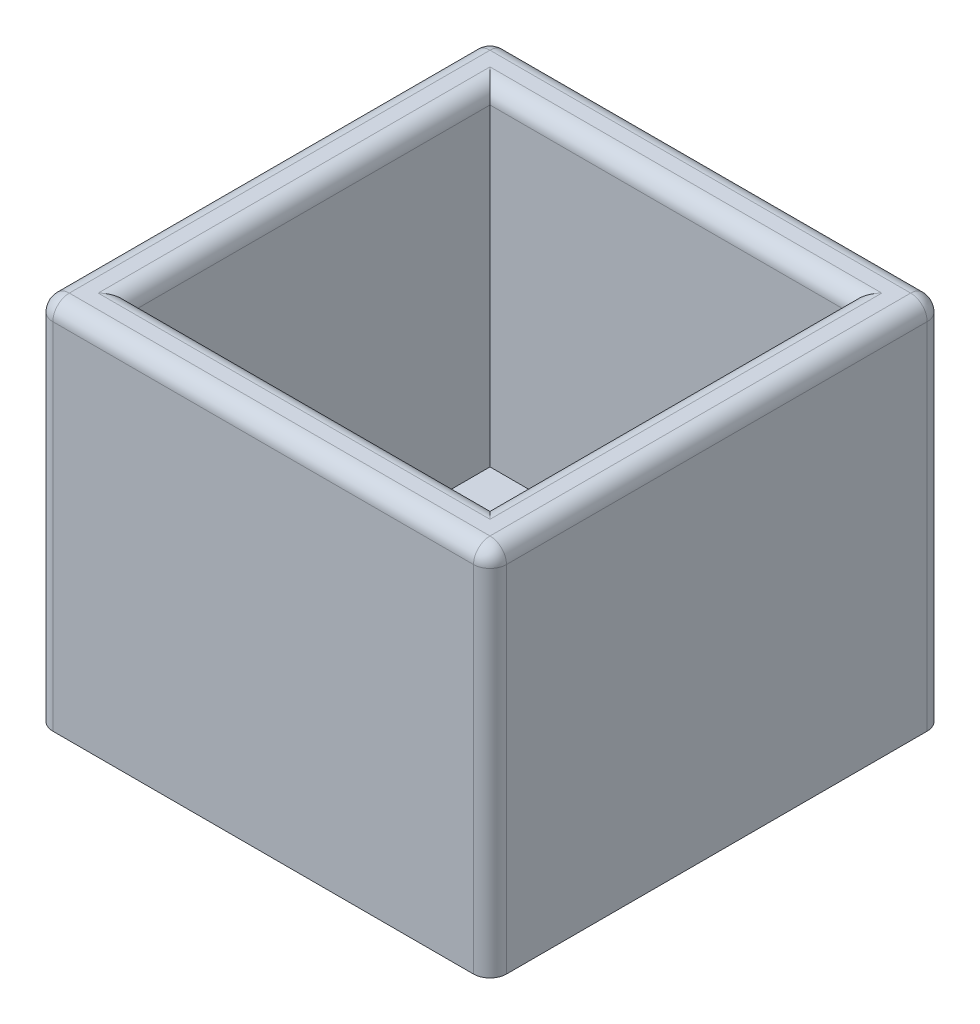
ISO-10303-21;
HEADER;
FILE_DESCRIPTION(('STEP AP214'),'2;1');
FILE_NAME('part.step','',(''),(''),'','','');
FILE_SCHEMA(('AUTOMOTIVE_DESIGN { 1 0 10303 214 1 1 1 1 }'));
ENDSEC;
DATA;
#1=APPLICATION_CONTEXT('core data for automotive mechanical design processes');
#2=APPLICATION_PROTOCOL_DEFINITION('international standard','automotive_design',2000,#1);
#3=PRODUCT_CONTEXT('',#1,'mechanical');
#4=PRODUCT('Part','Part','',(#3));
#5=PRODUCT_RELATED_PRODUCT_CATEGORY('part','',(#4));
#6=PRODUCT_DEFINITION_FORMATION('','',#4);
#7=PRODUCT_DEFINITION_CONTEXT('part definition',#1,'design');
#8=PRODUCT_DEFINITION('design','',#6,#7);
#9=PRODUCT_DEFINITION_SHAPE('','',#8);
#10=(LENGTH_UNIT() NAMED_UNIT(*) SI_UNIT(.MILLI.,.METRE.));
#11=(NAMED_UNIT(*) PLANE_ANGLE_UNIT() SI_UNIT($,.RADIAN.));
#12=(NAMED_UNIT(*) SI_UNIT($,.STERADIAN.) SOLID_ANGLE_UNIT());
#13=UNCERTAINTY_MEASURE_WITH_UNIT(LENGTH_MEASURE(1.E-05),#10,'distance_accuracy_value','');
#14=(GEOMETRIC_REPRESENTATION_CONTEXT(3) GLOBAL_UNCERTAINTY_ASSIGNED_CONTEXT((#13)) GLOBAL_UNIT_ASSIGNED_CONTEXT((#10,
#11,#12)) REPRESENTATION_CONTEXT('',''));
#15=CARTESIAN_POINT('',(0.,0.,0.));
#16=DIRECTION('',(0.,0.,1.));
#17=DIRECTION('',(1.,0.,0.));
#18=AXIS2_PLACEMENT_3D('',#15,#16,#17);
#19=CARTESIAN_POINT('',(-27.5,22.5,55.));
#20=DIRECTION('',(0.,-1.,0.));
#21=DIRECTION('',(0.,0.,-1.));
#22=AXIS2_PLACEMENT_3D('',#19,#20,#21);
#23=PLANE('',#22);
#24=DIRECTION('',(1.,0.,0.));
#25=VECTOR('',#24,1.);
#26=CARTESIAN_POINT('',(-27.5,22.5,51.25));
#27=LINE('',#26,#25);
#28=CARTESIAN_POINT('',(23.75,22.5,51.25));
#29=VERTEX_POINT('',#28);
#30=CARTESIAN_POINT('',(-23.75,22.5,51.25));
#31=VERTEX_POINT('',#30);
#32=EDGE_CURVE('E211',#29,#31,#27,.F.);
#33=ORIENTED_EDGE('',*,*,#32,.T.);
#34=DIRECTION('',(0.,0.,1.));
#35=VECTOR('',#34,1.);
#36=CARTESIAN_POINT('',(-23.75,22.5,55.));
#37=LINE('',#36,#35);
#38=CARTESIAN_POINT('',(-23.75,22.5,3.75000000000001));
#39=VERTEX_POINT('',#38);
#40=EDGE_CURVE('E213',#31,#39,#37,.F.);
#41=ORIENTED_EDGE('',*,*,#40,.T.);
#42=DIRECTION('',(1.,0.,0.));
#43=VECTOR('',#42,1.);
#44=CARTESIAN_POINT('',(21.75,22.5,3.75000000000001));
#45=LINE('',#44,#43);
#46=CARTESIAN_POINT('',(23.75,22.5,3.75000000000001));
#47=VERTEX_POINT('',#46);
#48=EDGE_CURVE('E209',#39,#47,#45,.T.);
#49=ORIENTED_EDGE('',*,*,#48,.T.);
#50=DIRECTION('',(0.,0.,1.));
#51=VECTOR('',#50,1.);
#52=CARTESIAN_POINT('',(23.75,22.5,49.25));
#53=LINE('',#52,#51);
#54=EDGE_CURVE('E207',#47,#29,#53,.T.);
#55=ORIENTED_EDGE('',*,*,#54,.T.);
#56=EDGE_LOOP('',(#33,#41,#49,#55));
#57=FACE_BOUND('',#56,.T.);
#58=DIRECTION('',(-1.,0.,0.));
#59=VECTOR('',#58,1.);
#60=CARTESIAN_POINT('',(-27.5,22.5,2.));
#61=LINE('',#60,#59);
#62=CARTESIAN_POINT('',(25.5,22.5,2.));
#63=VERTEX_POINT('',#62);
#64=CARTESIAN_POINT('',(-25.5,22.5,2.));
#65=VERTEX_POINT('',#64);
#66=EDGE_CURVE('E202',#63,#65,#61,.T.);
#67=ORIENTED_EDGE('',*,*,#66,.T.);
#68=DIRECTION('',(0.,0.,-1.));
#69=VECTOR('',#68,1.);
#70=CARTESIAN_POINT('',(-25.5,22.5,55.));
#71=LINE('',#70,#69);
#72=CARTESIAN_POINT('',(-25.5,22.5,53.));
#73=VERTEX_POINT('',#72);
#74=EDGE_CURVE('E204',#65,#73,#71,.F.);
#75=ORIENTED_EDGE('',*,*,#74,.T.);
#76=DIRECTION('',(-1.,0.,0.));
#77=VECTOR('',#76,1.);
#78=CARTESIAN_POINT('',(27.5,22.5,53.));
#79=LINE('',#78,#77);
#80=CARTESIAN_POINT('',(25.5,22.5,53.));
#81=VERTEX_POINT('',#80);
#82=EDGE_CURVE('E198',#73,#81,#79,.F.);
#83=ORIENTED_EDGE('',*,*,#82,.T.);
#84=DIRECTION('',(0.,0.,-1.));
#85=VECTOR('',#84,1.);
#86=CARTESIAN_POINT('',(25.5,22.5,55.));
#87=LINE('',#86,#85);
#88=EDGE_CURVE('E200',#81,#63,#87,.T.);
#89=ORIENTED_EDGE('',*,*,#88,.T.);
#90=EDGE_LOOP('',(#67,#75,#83,#89));
#91=FACE_BOUND('',#90,.T.);
#92=ADVANCED_FACE('F33',(#57,#91),#23,.F.);
#93=CARTESIAN_POINT('',(27.5,22.5,55.));
#94=DIRECTION('',(-1.,0.,0.));
#95=DIRECTION('',(0.,0.,1.));
#96=AXIS2_PLACEMENT_3D('',#93,#94,#95);
#97=PLANE('',#96);
#98=DIRECTION('',(0.,0.,-1.));
#99=VECTOR('',#98,1.);
#100=CARTESIAN_POINT('',(27.5,-22.5,55.));
#101=LINE('',#100,#99);
#102=CARTESIAN_POINT('',(27.5,-22.5,53.));
#103=VERTEX_POINT('',#102);
#104=CARTESIAN_POINT('',(27.5,-22.5,2.));
#105=VERTEX_POINT('',#104);
#106=EDGE_CURVE('E187',#103,#105,#101,.T.);
#107=ORIENTED_EDGE('',*,*,#106,.T.);
#108=DIRECTION('',(0.,1.,0.));
#109=VECTOR('',#108,1.);
#110=CARTESIAN_POINT('',(27.5,22.5,2.));
#111=LINE('',#110,#109);
#112=CARTESIAN_POINT('',(27.5,20.5,2.));
#113=VERTEX_POINT('',#112);
#114=EDGE_CURVE('E246',#105,#113,#111,.T.);
#115=ORIENTED_EDGE('',*,*,#114,.T.);
#116=DIRECTION('',(0.,0.,-1.));
#117=VECTOR('',#116,1.);
#118=CARTESIAN_POINT('',(27.5,20.5,55.));
#119=LINE('',#118,#117);
#120=CARTESIAN_POINT('',(27.5,20.5,53.));
#121=VERTEX_POINT('',#120);
#122=EDGE_CURVE('E244',#113,#121,#119,.F.);
#123=ORIENTED_EDGE('',*,*,#122,.T.);
#124=DIRECTION('',(0.,1.,0.));
#125=VECTOR('',#124,1.);
#126=CARTESIAN_POINT('',(27.5,-22.5,53.));
#127=LINE('',#126,#125);
#128=EDGE_CURVE('E242',#121,#103,#127,.F.);
#129=ORIENTED_EDGE('',*,*,#128,.T.);
#130=EDGE_LOOP('',(#107,#115,#123,#129));
#131=FACE_BOUND('',#130,.T.);
#132=ADVANCED_FACE('F300',(#131),#97,.F.);
#133=CARTESIAN_POINT('',(-27.5,22.5,55.));
#134=DIRECTION('',(1.,0.,0.));
#135=DIRECTION('',(0.,0.,-1.));
#136=AXIS2_PLACEMENT_3D('',#133,#134,#135);
#137=PLANE('',#136);
#138=DIRECTION('',(0.,0.,-1.));
#139=VECTOR('',#138,1.);
#140=CARTESIAN_POINT('',(-27.5,20.5,55.));
#141=LINE('',#140,#139);
#142=CARTESIAN_POINT('',(-27.5,20.5,53.));
#143=VERTEX_POINT('',#142);
#144=CARTESIAN_POINT('',(-27.5,20.5,2.));
#145=VERTEX_POINT('',#144);
#146=EDGE_CURVE('E223',#143,#145,#141,.T.);
#147=ORIENTED_EDGE('',*,*,#146,.T.);
#148=DIRECTION('',(0.,-1.,0.));
#149=VECTOR('',#148,1.);
#150=CARTESIAN_POINT('',(-27.5,22.5,2.));
#151=LINE('',#150,#149);
#152=CARTESIAN_POINT('',(-27.5,-22.5,2.));
#153=VERTEX_POINT('',#152);
#154=EDGE_CURVE('E225',#145,#153,#151,.T.);
#155=ORIENTED_EDGE('',*,*,#154,.T.);
#156=DIRECTION('',(0.,0.,-1.));
#157=VECTOR('',#156,1.);
#158=CARTESIAN_POINT('',(-27.5,-22.5,55.));
#159=LINE('',#158,#157);
#160=CARTESIAN_POINT('',(-27.5,-22.5,53.));
#161=VERTEX_POINT('',#160);
#162=EDGE_CURVE('E192',#161,#153,#159,.T.);
#163=ORIENTED_EDGE('',*,*,#162,.F.);
#164=DIRECTION('',(0.,-1.,0.));
#165=VECTOR('',#164,1.);
#166=CARTESIAN_POINT('',(-27.5,22.5,53.));
#167=LINE('',#166,#165);
#168=EDGE_CURVE('E221',#161,#143,#167,.F.);
#169=ORIENTED_EDGE('',*,*,#168,.T.);
#170=EDGE_LOOP('',(#147,#155,#163,#169));
#171=FACE_BOUND('',#170,.T.);
#172=ADVANCED_FACE('F352',(#171),#137,.F.);
#173=CARTESIAN_POINT('',(-27.5,-22.5,55.));
#174=DIRECTION('',(0.,1.,0.));
#175=DIRECTION('',(0.,0.,1.));
#176=AXIS2_PLACEMENT_3D('',#173,#174,#175);
#177=PLANE('',#176);
#178=ORIENTED_EDGE('',*,*,#162,.T.);
#179=CARTESIAN_POINT('',(-25.5,-22.5,2.));
#180=DIRECTION('',(0.,1.,0.));
#181=DIRECTION('',(0.,0.,1.));
#182=AXIS2_PLACEMENT_3D('',#179,#180,#181);
#183=CIRCLE('',#182,2.);
#184=CARTESIAN_POINT('',(-25.5,-22.5,0.));
#185=VERTEX_POINT('',#184);
#186=EDGE_CURVE('E234',#153,#185,#183,.F.);
#187=ORIENTED_EDGE('',*,*,#186,.T.);
#188=DIRECTION('',(1.,0.,0.));
#189=VECTOR('',#188,1.);
#190=CARTESIAN_POINT('',(-27.5,-22.5,0.));
#191=LINE('',#190,#189);
#192=CARTESIAN_POINT('',(25.5,-22.5,0.));
#193=VERTEX_POINT('',#192);
#194=EDGE_CURVE('E180',#185,#193,#191,.T.);
#195=ORIENTED_EDGE('',*,*,#194,.T.);
#196=CARTESIAN_POINT('',(25.5,-22.5,2.));
#197=DIRECTION('',(0.,1.,0.));
#198=DIRECTION('',(0.,0.,1.));
#199=AXIS2_PLACEMENT_3D('',#196,#197,#198);
#200=CIRCLE('',#199,2.);
#201=EDGE_CURVE('E232',#193,#105,#200,.F.);
#202=ORIENTED_EDGE('',*,*,#201,.T.);
#203=ORIENTED_EDGE('',*,*,#106,.F.);
#204=CARTESIAN_POINT('',(25.5,-22.5,53.));
#205=DIRECTION('',(0.,1.,0.));
#206=DIRECTION('',(0.,0.,1.));
#207=AXIS2_PLACEMENT_3D('',#204,#205,#206);
#208=CIRCLE('',#207,2.);
#209=CARTESIAN_POINT('',(25.5,-22.5,55.));
#210=VERTEX_POINT('',#209);
#211=EDGE_CURVE('E230',#103,#210,#208,.F.);
#212=ORIENTED_EDGE('',*,*,#211,.T.);
#213=DIRECTION('',(1.,0.,0.));
#214=VECTOR('',#213,1.);
#215=CARTESIAN_POINT('',(-27.5,-22.5,55.));
#216=LINE('',#215,#214);
#217=CARTESIAN_POINT('',(-25.5,-22.5,55.));
#218=VERTEX_POINT('',#217);
#219=EDGE_CURVE('E185',#218,#210,#216,.T.);
#220=ORIENTED_EDGE('',*,*,#219,.F.);
#221=CARTESIAN_POINT('',(-25.5,-22.5,53.));
#222=DIRECTION('',(0.,1.,0.));
#223=DIRECTION('',(0.,0.,1.));
#224=AXIS2_PLACEMENT_3D('',#221,#222,#223);
#225=CIRCLE('',#224,2.);
#226=EDGE_CURVE('E228',#218,#161,#225,.F.);
#227=ORIENTED_EDGE('',*,*,#226,.T.);
#228=EDGE_LOOP('',(#178,#187,#195,#202,#203,#212,#220,#227));
#229=FACE_BOUND('',#228,.T.);
#230=ADVANCED_FACE('F303',(#229),#177,.F.);
#231=CARTESIAN_POINT('',(0.,0.,55.));
#232=DIRECTION('',(0.,0.,1.));
#233=DIRECTION('',(1.,0.,0.));
#234=AXIS2_PLACEMENT_3D('',#231,#232,#233);
#235=PLANE('',#234);
#236=ORIENTED_EDGE('',*,*,#219,.T.);
#237=DIRECTION('',(0.,1.,0.));
#238=VECTOR('',#237,1.);
#239=CARTESIAN_POINT('',(25.5,22.5,55.));
#240=LINE('',#239,#238);
#241=CARTESIAN_POINT('',(25.5,20.5,55.));
#242=VERTEX_POINT('',#241);
#243=EDGE_CURVE('E11',#210,#242,#240,.T.);
#244=ORIENTED_EDGE('',*,*,#243,.T.);
#245=DIRECTION('',(-1.,0.,0.));
#246=VECTOR('',#245,1.);
#247=CARTESIAN_POINT('',(-27.5,20.5,55.));
#248=LINE('',#247,#246);
#249=CARTESIAN_POINT('',(-25.5,20.5,55.));
#250=VERTEX_POINT('',#249);
#251=EDGE_CURVE('E42',#242,#250,#248,.T.);
#252=ORIENTED_EDGE('',*,*,#251,.T.);
#253=DIRECTION('',(0.,-1.,0.));
#254=VECTOR('',#253,1.);
#255=CARTESIAN_POINT('',(-25.5,-22.5,55.));
#256=LINE('',#255,#254);
#257=EDGE_CURVE('E248',#250,#218,#256,.T.);
#258=ORIENTED_EDGE('',*,*,#257,.T.);
#259=EDGE_LOOP('',(#236,#244,#252,#258));
#260=FACE_BOUND('',#259,.T.);
#261=ADVANCED_FACE('F517',(#260),#235,.T.);
#262=CARTESIAN_POINT('',(0.,0.,0.));
#263=DIRECTION('',(0.,0.,1.));
#264=DIRECTION('',(1.,0.,0.));
#265=AXIS2_PLACEMENT_3D('',#262,#263,#264);
#266=PLANE('',#265);
#267=ORIENTED_EDGE('',*,*,#194,.F.);
#268=DIRECTION('',(0.,-1.,0.));
#269=VECTOR('',#268,1.);
#270=CARTESIAN_POINT('',(-25.5,0.,0.));
#271=LINE('',#270,#269);
#272=CARTESIAN_POINT('',(-25.5,20.5,0.));
#273=VERTEX_POINT('',#272);
#274=EDGE_CURVE('E240',#185,#273,#271,.F.);
#275=ORIENTED_EDGE('',*,*,#274,.T.);
#276=DIRECTION('',(-1.,0.,0.));
#277=VECTOR('',#276,1.);
#278=CARTESIAN_POINT('',(0.,20.5,0.));
#279=LINE('',#278,#277);
#280=CARTESIAN_POINT('',(25.5,20.5,0.));
#281=VERTEX_POINT('',#280);
#282=EDGE_CURVE('E238',#273,#281,#279,.F.);
#283=ORIENTED_EDGE('',*,*,#282,.T.);
#284=DIRECTION('',(0.,1.,0.));
#285=VECTOR('',#284,1.);
#286=CARTESIAN_POINT('',(25.5,0.,0.));
#287=LINE('',#286,#285);
#288=EDGE_CURVE('E236',#281,#193,#287,.F.);
#289=ORIENTED_EDGE('',*,*,#288,.T.);
#290=EDGE_LOOP('',(#267,#275,#283,#289));
#291=FACE_BOUND('',#290,.T.);
#292=ADVANCED_FACE('F525',(#291),#266,.F.);
#293=CARTESIAN_POINT('',(21.75,-17.5,0.));
#294=DIRECTION('',(-1.,0.,0.));
#295=DIRECTION('',(0.,0.,1.));
#296=AXIS2_PLACEMENT_3D('',#293,#294,#295);
#297=PLANE('',#296);
#298=DIRECTION('',(0.,1.,0.));
#299=VECTOR('',#298,1.);
#300=CARTESIAN_POINT('',(21.75,-17.5,49.25));
#301=LINE('',#300,#299);
#302=CARTESIAN_POINT('',(21.75,-17.5,49.25));
#303=VERTEX_POINT('',#302);
#304=CARTESIAN_POINT('',(21.75,20.5,49.25));
#305=VERTEX_POINT('',#304);
#306=EDGE_CURVE('E178',#303,#305,#301,.T.);
#307=ORIENTED_EDGE('',*,*,#306,.T.);
#308=DIRECTION('',(0.,0.,1.));
#309=VECTOR('',#308,1.);
#310=CARTESIAN_POINT('',(21.75,20.5,5.75000000000001));
#311=LINE('',#310,#309);
#312=CARTESIAN_POINT('',(21.75,20.5,5.75000000000001));
#313=VERTEX_POINT('',#312);
#314=EDGE_CURVE('E164',#305,#313,#311,.F.);
#315=ORIENTED_EDGE('',*,*,#314,.T.);
#316=DIRECTION('',(0.,1.,0.));
#317=VECTOR('',#316,1.);
#318=CARTESIAN_POINT('',(21.75,-17.5,5.75000000000001));
#319=LINE('',#318,#317);
#320=CARTESIAN_POINT('',(21.75,-17.5,5.75000000000001));
#321=VERTEX_POINT('',#320);
#322=EDGE_CURVE('E148',#321,#313,#319,.T.);
#323=ORIENTED_EDGE('',*,*,#322,.F.);
#324=DIRECTION('',(0.,0.,1.));
#325=VECTOR('',#324,1.);
#326=CARTESIAN_POINT('',(21.75,-17.5,0.));
#327=LINE('',#326,#325);
#328=EDGE_CURVE('E157',#321,#303,#327,.T.);
#329=ORIENTED_EDGE('',*,*,#328,.T.);
#330=EDGE_LOOP('',(#307,#315,#323,#329));
#331=FACE_BOUND('',#330,.T.);
#332=ADVANCED_FACE('F161',(#331),#297,.T.);
#333=CARTESIAN_POINT('',(0.,-17.5,49.25));
#334=DIRECTION('',(0.,0.,1.));
#335=DIRECTION('',(1.,0.,0.));
#336=AXIS2_PLACEMENT_3D('',#333,#334,#335);
#337=PLANE('',#336);
#338=DIRECTION('',(0.,1.,0.));
#339=VECTOR('',#338,1.);
#340=CARTESIAN_POINT('',(-21.75,-17.5,49.25));
#341=LINE('',#340,#339);
#342=CARTESIAN_POINT('',(-21.75,-17.5,49.25));
#343=VERTEX_POINT('',#342);
#344=CARTESIAN_POINT('',(-21.75,20.5,49.25));
#345=VERTEX_POINT('',#344);
#346=EDGE_CURVE('E181',#343,#345,#341,.T.);
#347=ORIENTED_EDGE('',*,*,#346,.T.);
#348=DIRECTION('',(1.,0.,0.));
#349=VECTOR('',#348,1.);
#350=CARTESIAN_POINT('',(0.,20.5,49.25));
#351=LINE('',#350,#349);
#352=EDGE_CURVE('E216',#345,#305,#351,.T.);
#353=ORIENTED_EDGE('',*,*,#352,.T.);
#354=ORIENTED_EDGE('',*,*,#306,.F.);
#355=DIRECTION('',(1.,0.,0.));
#356=VECTOR('',#355,1.);
#357=CARTESIAN_POINT('',(0.,-17.5,49.25));
#358=LINE('',#357,#356);
#359=EDGE_CURVE('E165',#343,#303,#358,.T.);
#360=ORIENTED_EDGE('',*,*,#359,.F.);
#361=EDGE_LOOP('',(#347,#353,#354,#360));
#362=FACE_BOUND('',#361,.T.);
#363=ADVANCED_FACE('F541',(#362),#337,.F.);
#364=CARTESIAN_POINT('',(-21.75,-17.5,0.));
#365=DIRECTION('',(-1.,0.,0.));
#366=DIRECTION('',(0.,0.,1.));
#367=AXIS2_PLACEMENT_3D('',#364,#365,#366);
#368=PLANE('',#367);
#369=DIRECTION('',(0.,1.,0.));
#370=VECTOR('',#369,1.);
#371=CARTESIAN_POINT('',(-21.75,-17.5,5.75000000000001));
#372=LINE('',#371,#370);
#373=CARTESIAN_POINT('',(-21.75,-17.5,5.75000000000001));
#374=VERTEX_POINT('',#373);
#375=CARTESIAN_POINT('',(-21.75,20.5,5.75000000000001));
#376=VERTEX_POINT('',#375);
#377=EDGE_CURVE('E151',#374,#376,#372,.T.);
#378=ORIENTED_EDGE('',*,*,#377,.T.);
#379=DIRECTION('',(0.,0.,1.));
#380=VECTOR('',#379,1.);
#381=CARTESIAN_POINT('',(-21.75,20.5,0.));
#382=LINE('',#381,#380);
#383=EDGE_CURVE('E195',#376,#345,#382,.T.);
#384=ORIENTED_EDGE('',*,*,#383,.T.);
#385=ORIENTED_EDGE('',*,*,#346,.F.);
#386=DIRECTION('',(0.,0.,1.));
#387=VECTOR('',#386,1.);
#388=CARTESIAN_POINT('',(-21.75,-17.5,0.));
#389=LINE('',#388,#387);
#390=EDGE_CURVE('E156',#374,#343,#389,.T.);
#391=ORIENTED_EDGE('',*,*,#390,.F.);
#392=EDGE_LOOP('',(#378,#384,#385,#391));
#393=FACE_BOUND('',#392,.T.);
#394=ADVANCED_FACE('F550',(#393),#368,.F.);
#395=CARTESIAN_POINT('',(0.,-17.5,5.75000000000001));
#396=DIRECTION('',(0.,0.,1.));
#397=DIRECTION('',(1.,0.,0.));
#398=AXIS2_PLACEMENT_3D('',#395,#396,#397);
#399=PLANE('',#398);
#400=ORIENTED_EDGE('',*,*,#322,.T.);
#401=DIRECTION('',(1.,0.,0.));
#402=VECTOR('',#401,1.);
#403=CARTESIAN_POINT('',(-21.75,20.5,5.75000000000001));
#404=LINE('',#403,#402);
#405=EDGE_CURVE('E218',#313,#376,#404,.F.);
#406=ORIENTED_EDGE('',*,*,#405,.T.);
#407=ORIENTED_EDGE('',*,*,#377,.F.);
#408=DIRECTION('',(1.,0.,0.));
#409=VECTOR('',#408,1.);
#410=CARTESIAN_POINT('',(0.,-17.5,5.75000000000001));
#411=LINE('',#410,#409);
#412=EDGE_CURVE('E145',#374,#321,#411,.T.);
#413=ORIENTED_EDGE('',*,*,#412,.T.);
#414=EDGE_LOOP('',(#400,#406,#407,#413));
#415=FACE_BOUND('',#414,.T.);
#416=ADVANCED_FACE('F147',(#415),#399,.T.);
#417=CARTESIAN_POINT('',(0.,-17.5,0.));
#418=DIRECTION('',(0.,1.,0.));
#419=DIRECTION('',(0.,0.,1.));
#420=AXIS2_PLACEMENT_3D('',#417,#418,#419);
#421=PLANE('',#420);
#422=ORIENTED_EDGE('',*,*,#328,.F.);
#423=ORIENTED_EDGE('',*,*,#412,.F.);
#424=ORIENTED_EDGE('',*,*,#390,.T.);
#425=ORIENTED_EDGE('',*,*,#359,.T.);
#426=EDGE_LOOP('',(#422,#423,#424,#425));
#427=FACE_BOUND('',#426,.T.);
#428=ADVANCED_FACE('F168',(#427),#421,.T.);
#429=CARTESIAN_POINT('',(23.75,20.5,55.));
#430=DIRECTION('',(0.,0.,-1.));
#431=DIRECTION('',(-1.,0.,0.));
#432=AXIS2_PLACEMENT_3D('',#429,#430,#431);
#433=CYLINDRICAL_SURFACE('',#432,2.);
#434=CARTESIAN_POINT('',(23.75,20.5,51.25));
#435=DIRECTION('',(0.707106781186547,0.,-0.707106781186547));
#436=DIRECTION('',(0.707106781186547,0.,0.707106781186547));
#437=AXIS2_PLACEMENT_3D('',#434,#435,#436);
#438=ELLIPSE('',#437,2.82842712474619,2.);
#439=EDGE_CURVE('E173',#29,#305,#438,.F.);
#440=ORIENTED_EDGE('',*,*,#439,.F.);
#441=ORIENTED_EDGE('',*,*,#54,.F.);
#442=CARTESIAN_POINT('',(23.75,20.5,3.75000000000001));
#443=DIRECTION('',(-0.707106781186547,0.,-0.707106781186547));
#444=DIRECTION('',(-0.707106781186547,0.,0.707106781186547));
#445=AXIS2_PLACEMENT_3D('',#442,#443,#444);
#446=ELLIPSE('',#445,2.82842712474619,2.);
#447=EDGE_CURVE('E170',#313,#47,#446,.T.);
#448=ORIENTED_EDGE('',*,*,#447,.F.);
#449=ORIENTED_EDGE('',*,*,#314,.F.);
#450=EDGE_LOOP('',(#440,#441,#448,#449));
#451=FACE_BOUND('',#450,.T.);
#452=ADVANCED_FACE('F368',(#451),#433,.T.);
#453=CARTESIAN_POINT('',(-27.5,20.5,3.75000000000001));
#454=DIRECTION('',(-1.,0.,0.));
#455=DIRECTION('',(0.,0.,1.));
#456=AXIS2_PLACEMENT_3D('',#453,#454,#455);
#457=CYLINDRICAL_SURFACE('',#456,2.);
#458=ORIENTED_EDGE('',*,*,#447,.T.);
#459=ORIENTED_EDGE('',*,*,#48,.F.);
#460=CARTESIAN_POINT('',(-23.75,20.5,3.75000000000001));
#461=DIRECTION('',(-0.707106781186547,0.,0.707106781186547));
#462=DIRECTION('',(0.707106781186547,0.,0.707106781186547));
#463=AXIS2_PLACEMENT_3D('',#460,#461,#462);
#464=ELLIPSE('',#463,2.82842712474619,2.);
#465=EDGE_CURVE('E253',#376,#39,#464,.T.);
#466=ORIENTED_EDGE('',*,*,#465,.F.);
#467=ORIENTED_EDGE('',*,*,#405,.F.);
#468=EDGE_LOOP('',(#458,#459,#466,#467));
#469=FACE_BOUND('',#468,.T.);
#470=ADVANCED_FACE('F364',(#469),#457,.T.);
#471=CARTESIAN_POINT('',(0.,20.5,51.25));
#472=DIRECTION('',(1.,0.,0.));
#473=DIRECTION('',(0.,0.,-1.));
#474=AXIS2_PLACEMENT_3D('',#471,#472,#473);
#475=CYLINDRICAL_SURFACE('',#474,2.);
#476=ORIENTED_EDGE('',*,*,#439,.T.);
#477=ORIENTED_EDGE('',*,*,#352,.F.);
#478=CARTESIAN_POINT('',(-23.75,20.5,51.25));
#479=DIRECTION('',(0.707106781186547,0.,0.707106781186547));
#480=DIRECTION('',(-0.707106781186547,0.,0.707106781186547));
#481=AXIS2_PLACEMENT_3D('',#478,#479,#480);
#482=ELLIPSE('',#481,2.82842712474619,2.);
#483=EDGE_CURVE('E251',#31,#345,#482,.F.);
#484=ORIENTED_EDGE('',*,*,#483,.F.);
#485=ORIENTED_EDGE('',*,*,#32,.F.);
#486=EDGE_LOOP('',(#476,#477,#484,#485));
#487=FACE_BOUND('',#486,.T.);
#488=ADVANCED_FACE('F360',(#487),#475,.T.);
#489=CARTESIAN_POINT('',(-23.75,20.5,0.));
#490=DIRECTION('',(0.,0.,1.));
#491=DIRECTION('',(1.,0.,0.));
#492=AXIS2_PLACEMENT_3D('',#489,#490,#491);
#493=CYLINDRICAL_SURFACE('',#492,2.);
#494=ORIENTED_EDGE('',*,*,#465,.T.);
#495=ORIENTED_EDGE('',*,*,#40,.F.);
#496=ORIENTED_EDGE('',*,*,#483,.T.);
#497=ORIENTED_EDGE('',*,*,#383,.F.);
#498=EDGE_LOOP('',(#494,#495,#496,#497));
#499=FACE_BOUND('',#498,.T.);
#500=ADVANCED_FACE('F357',(#499),#493,.T.);
#501=CARTESIAN_POINT('',(25.5,0.,53.));
#502=DIRECTION('',(0.,-1.,0.));
#503=DIRECTION('',(0.,0.,-1.));
#504=AXIS2_PLACEMENT_3D('',#501,#502,#503);
#505=CYLINDRICAL_SURFACE('',#504,2.);
#506=CARTESIAN_POINT('',(25.5,20.5,53.));
#507=DIRECTION('',(0.,1.,0.));
#508=DIRECTION('',(0.,0.,1.));
#509=AXIS2_PLACEMENT_3D('',#506,#507,#508);
#510=CIRCLE('',#509,2.);
#511=EDGE_CURVE('E37',#242,#121,#510,.T.);
#512=ORIENTED_EDGE('',*,*,#511,.F.);
#513=ORIENTED_EDGE('',*,*,#243,.F.);
#514=ORIENTED_EDGE('',*,*,#211,.F.);
#515=ORIENTED_EDGE('',*,*,#128,.F.);
#516=EDGE_LOOP('',(#512,#513,#514,#515));
#517=FACE_BOUND('',#516,.T.);
#518=ADVANCED_FACE('F35',(#517),#505,.T.);
#519=CARTESIAN_POINT('',(25.5,20.5,53.));
#520=DIRECTION('',(0.,0.,1.));
#521=DIRECTION('',(1.,0.,0.));
#522=AXIS2_PLACEMENT_3D('',#519,#520,#521);
#523=SPHERICAL_SURFACE('',#522,2.);
#524=CARTESIAN_POINT('',(25.5,20.5,53.));
#525=DIRECTION('',(1.,0.,0.));
#526=DIRECTION('',(0.,0.,-1.));
#527=AXIS2_PLACEMENT_3D('',#524,#525,#526);
#528=CIRCLE('',#527,2.);
#529=EDGE_CURVE('E283',#242,#81,#528,.F.);
#530=ORIENTED_EDGE('',*,*,#529,.F.);
#531=ORIENTED_EDGE('',*,*,#511,.T.);
#532=CARTESIAN_POINT('',(25.5,20.5,53.));
#533=DIRECTION('',(0.,0.,1.));
#534=DIRECTION('',(1.,0.,0.));
#535=AXIS2_PLACEMENT_3D('',#532,#533,#534);
#536=CIRCLE('',#535,2.);
#537=EDGE_CURVE('E285',#81,#121,#536,.F.);
#538=ORIENTED_EDGE('',*,*,#537,.F.);
#539=EDGE_LOOP('',(#530,#531,#538));
#540=FACE_BOUND('',#539,.T.);
#541=ADVANCED_FACE('F294',(#540),#523,.T.);
#542=CARTESIAN_POINT('',(25.5,22.5,2.));
#543=DIRECTION('',(0.,1.,0.));
#544=DIRECTION('',(0.,0.,1.));
#545=AXIS2_PLACEMENT_3D('',#542,#543,#544);
#546=CYLINDRICAL_SURFACE('',#545,2.);
#547=ORIENTED_EDGE('',*,*,#201,.F.);
#548=ORIENTED_EDGE('',*,*,#288,.F.);
#549=CARTESIAN_POINT('',(25.5,20.5,2.));
#550=DIRECTION('',(0.,1.,0.));
#551=DIRECTION('',(0.,0.,1.));
#552=AXIS2_PLACEMENT_3D('',#549,#550,#551);
#553=CIRCLE('',#552,2.);
#554=EDGE_CURVE('E280',#113,#281,#553,.T.);
#555=ORIENTED_EDGE('',*,*,#554,.F.);
#556=ORIENTED_EDGE('',*,*,#114,.F.);
#557=EDGE_LOOP('',(#547,#548,#555,#556));
#558=FACE_BOUND('',#557,.T.);
#559=ADVANCED_FACE('F309',(#558),#546,.T.);
#560=CARTESIAN_POINT('',(25.5,20.5,55.));
#561=DIRECTION('',(0.,0.,-1.));
#562=DIRECTION('',(-1.,0.,0.));
#563=AXIS2_PLACEMENT_3D('',#560,#561,#562);
#564=CYLINDRICAL_SURFACE('',#563,2.);
#565=ORIENTED_EDGE('',*,*,#537,.T.);
#566=ORIENTED_EDGE('',*,*,#122,.F.);
#567=CARTESIAN_POINT('',(25.5,20.5,2.));
#568=DIRECTION('',(0.,0.,-1.));
#569=DIRECTION('',(-1.,0.,0.));
#570=AXIS2_PLACEMENT_3D('',#567,#568,#569);
#571=CIRCLE('',#570,2.);
#572=EDGE_CURVE('E277',#63,#113,#571,.T.);
#573=ORIENTED_EDGE('',*,*,#572,.F.);
#574=ORIENTED_EDGE('',*,*,#88,.F.);
#575=EDGE_LOOP('',(#565,#566,#573,#574));
#576=FACE_BOUND('',#575,.T.);
#577=ADVANCED_FACE('F312',(#576),#564,.T.);
#578=CARTESIAN_POINT('',(0.,20.5,53.));
#579=DIRECTION('',(1.,0.,0.));
#580=DIRECTION('',(0.,0.,-1.));
#581=AXIS2_PLACEMENT_3D('',#578,#579,#580);
#582=CYLINDRICAL_SURFACE('',#581,2.);
#583=ORIENTED_EDGE('',*,*,#529,.T.);
#584=ORIENTED_EDGE('',*,*,#82,.F.);
#585=CARTESIAN_POINT('',(-25.5,20.5,53.));
#586=DIRECTION('',(-1.,0.,0.));
#587=DIRECTION('',(0.,0.,1.));
#588=AXIS2_PLACEMENT_3D('',#585,#586,#587);
#589=CIRCLE('',#588,2.);
#590=EDGE_CURVE('E274',#250,#73,#589,.T.);
#591=ORIENTED_EDGE('',*,*,#590,.F.);
#592=ORIENTED_EDGE('',*,*,#251,.F.);
#593=EDGE_LOOP('',(#583,#584,#591,#592));
#594=FACE_BOUND('',#593,.T.);
#595=ADVANCED_FACE('F335',(#594),#582,.T.);
#596=CARTESIAN_POINT('',(-25.5,0.,53.));
#597=DIRECTION('',(0.,1.,0.));
#598=DIRECTION('',(0.,0.,1.));
#599=AXIS2_PLACEMENT_3D('',#596,#597,#598);
#600=CYLINDRICAL_SURFACE('',#599,2.);
#601=ORIENTED_EDGE('',*,*,#226,.F.);
#602=ORIENTED_EDGE('',*,*,#257,.F.);
#603=CARTESIAN_POINT('',(-25.5,20.5,53.));
#604=DIRECTION('',(0.,1.,0.));
#605=DIRECTION('',(0.,0.,1.));
#606=AXIS2_PLACEMENT_3D('',#603,#604,#605);
#607=CIRCLE('',#606,2.);
#608=EDGE_CURVE('E271',#143,#250,#607,.T.);
#609=ORIENTED_EDGE('',*,*,#608,.F.);
#610=ORIENTED_EDGE('',*,*,#168,.F.);
#611=EDGE_LOOP('',(#601,#602,#609,#610));
#612=FACE_BOUND('',#611,.T.);
#613=ADVANCED_FACE('F337',(#612),#600,.T.);
#614=CARTESIAN_POINT('',(25.5,20.5,2.));
#615=DIRECTION('',(0.,0.,1.));
#616=DIRECTION('',(1.,0.,0.));
#617=AXIS2_PLACEMENT_3D('',#614,#615,#616);
#618=SPHERICAL_SURFACE('',#617,2.);
#619=ORIENTED_EDGE('',*,*,#572,.T.);
#620=ORIENTED_EDGE('',*,*,#554,.T.);
#621=CARTESIAN_POINT('',(25.5,20.5,2.));
#622=DIRECTION('',(1.,0.,0.));
#623=DIRECTION('',(0.,1.,0.));
#624=AXIS2_PLACEMENT_3D('',#621,#622,#623);
#625=CIRCLE('',#624,2.);
#626=EDGE_CURVE('E268',#63,#281,#625,.F.);
#627=ORIENTED_EDGE('',*,*,#626,.F.);
#628=EDGE_LOOP('',(#619,#620,#627));
#629=FACE_BOUND('',#628,.T.);
#630=ADVANCED_FACE('F316',(#629),#618,.T.);
#631=CARTESIAN_POINT('',(-25.5,20.5,53.));
#632=DIRECTION('',(0.,0.,1.));
#633=DIRECTION('',(1.,0.,0.));
#634=AXIS2_PLACEMENT_3D('',#631,#632,#633);
#635=SPHERICAL_SURFACE('',#634,2.);
#636=ORIENTED_EDGE('',*,*,#608,.T.);
#637=ORIENTED_EDGE('',*,*,#590,.T.);
#638=CARTESIAN_POINT('',(-25.5,20.5,53.));
#639=DIRECTION('',(0.,0.,1.));
#640=DIRECTION('',(1.,0.,0.));
#641=AXIS2_PLACEMENT_3D('',#638,#639,#640);
#642=CIRCLE('',#641,2.);
#643=EDGE_CURVE('E266',#143,#73,#642,.F.);
#644=ORIENTED_EDGE('',*,*,#643,.F.);
#645=EDGE_LOOP('',(#636,#637,#644));
#646=FACE_BOUND('',#645,.T.);
#647=ADVANCED_FACE('F332',(#646),#635,.T.);
#648=CARTESIAN_POINT('',(-27.5,20.5,2.));
#649=DIRECTION('',(-1.,0.,0.));
#650=DIRECTION('',(0.,0.,1.));
#651=AXIS2_PLACEMENT_3D('',#648,#649,#650);
#652=CYLINDRICAL_SURFACE('',#651,2.);
#653=ORIENTED_EDGE('',*,*,#626,.T.);
#654=ORIENTED_EDGE('',*,*,#282,.F.);
#655=CARTESIAN_POINT('',(-25.5,20.5,2.));
#656=DIRECTION('',(-1.,0.,0.));
#657=DIRECTION('',(0.,0.,1.));
#658=AXIS2_PLACEMENT_3D('',#655,#656,#657);
#659=CIRCLE('',#658,2.);
#660=EDGE_CURVE('E263',#65,#273,#659,.T.);
#661=ORIENTED_EDGE('',*,*,#660,.F.);
#662=ORIENTED_EDGE('',*,*,#66,.F.);
#663=EDGE_LOOP('',(#653,#654,#661,#662));
#664=FACE_BOUND('',#663,.T.);
#665=ADVANCED_FACE('F320',(#664),#652,.T.);
#666=CARTESIAN_POINT('',(-25.5,20.5,55.));
#667=DIRECTION('',(0.,0.,-1.));
#668=DIRECTION('',(-1.,0.,0.));
#669=AXIS2_PLACEMENT_3D('',#666,#667,#668);
#670=CYLINDRICAL_SURFACE('',#669,2.);
#671=ORIENTED_EDGE('',*,*,#643,.T.);
#672=ORIENTED_EDGE('',*,*,#74,.F.);
#673=CARTESIAN_POINT('',(-25.5,20.5,2.));
#674=DIRECTION('',(0.,0.,-1.));
#675=DIRECTION('',(-1.,0.,0.));
#676=AXIS2_PLACEMENT_3D('',#673,#674,#675);
#677=CIRCLE('',#676,2.);
#678=EDGE_CURVE('E260',#145,#65,#677,.T.);
#679=ORIENTED_EDGE('',*,*,#678,.F.);
#680=ORIENTED_EDGE('',*,*,#146,.F.);
#681=EDGE_LOOP('',(#671,#672,#679,#680));
#682=FACE_BOUND('',#681,.T.);
#683=ADVANCED_FACE('F325',(#682),#670,.T.);
#684=CARTESIAN_POINT('',(-25.5,20.5,2.));
#685=DIRECTION('',(0.,0.,1.));
#686=DIRECTION('',(1.,0.,0.));
#687=AXIS2_PLACEMENT_3D('',#684,#685,#686);
#688=SPHERICAL_SURFACE('',#687,2.);
#689=ORIENTED_EDGE('',*,*,#678,.T.);
#690=ORIENTED_EDGE('',*,*,#660,.T.);
#691=CARTESIAN_POINT('',(-25.5,20.5,2.));
#692=DIRECTION('',(0.,1.,0.));
#693=DIRECTION('',(0.,0.,1.));
#694=AXIS2_PLACEMENT_3D('',#691,#692,#693);
#695=CIRCLE('',#694,2.);
#696=EDGE_CURVE('E257',#145,#273,#695,.F.);
#697=ORIENTED_EDGE('',*,*,#696,.F.);
#698=EDGE_LOOP('',(#689,#690,#697));
#699=FACE_BOUND('',#698,.T.);
#700=ADVANCED_FACE('F376',(#699),#688,.T.);
#701=CARTESIAN_POINT('',(-25.5,22.5,2.));
#702=DIRECTION('',(0.,-1.,0.));
#703=DIRECTION('',(0.,0.,-1.));
#704=AXIS2_PLACEMENT_3D('',#701,#702,#703);
#705=CYLINDRICAL_SURFACE('',#704,2.);
#706=ORIENTED_EDGE('',*,*,#696,.T.);
#707=ORIENTED_EDGE('',*,*,#274,.F.);
#708=ORIENTED_EDGE('',*,*,#186,.F.);
#709=ORIENTED_EDGE('',*,*,#154,.F.);
#710=EDGE_LOOP('',(#706,#707,#708,#709));
#711=FACE_BOUND('',#710,.T.);
#712=ADVANCED_FACE('F373',(#711),#705,.T.);
#713=CLOSED_SHELL('',(#92,#132,#172,#230,#261,#292,#332,#363,#394,#416,#428,#452,#470,#488,#500,
#518,#541,#559,#577,#595,#613,#630,#647,#665,#683,#700,#712));
#714=MANIFOLD_SOLID_BREP('B2',#713);
#715=ADVANCED_BREP_SHAPE_REPRESENTATION('',(#18,#714),#14);
#716=SHAPE_DEFINITION_REPRESENTATION(#9,#715);
ENDSEC;
END-ISO-10303-21;
